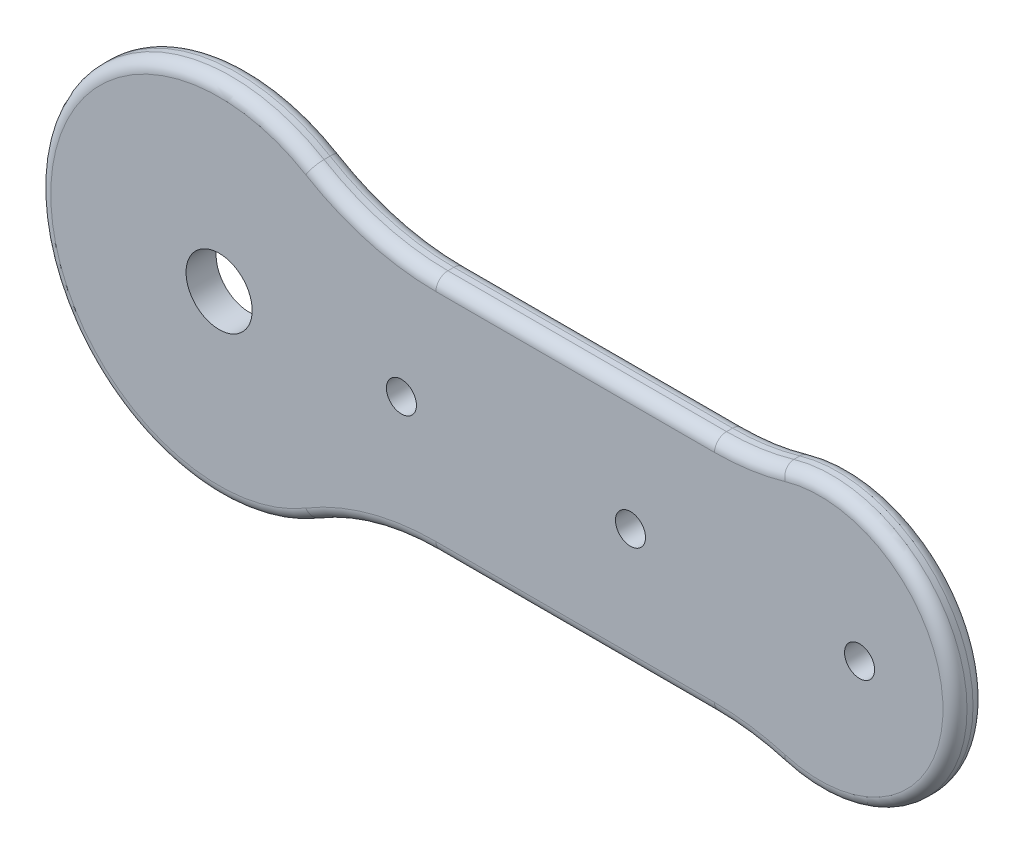
ISO-10303-21;
HEADER;
FILE_DESCRIPTION(('STEP AP214'),'2;1');
FILE_NAME('part.step','',(''),(''),'','','');
FILE_SCHEMA(('AUTOMOTIVE_DESIGN { 1 0 10303 214 1 1 1 1 }'));
ENDSEC;
DATA;
#1=APPLICATION_CONTEXT('core data for automotive mechanical design processes');
#2=APPLICATION_PROTOCOL_DEFINITION('international standard','automotive_design',2000,#1);
#3=PRODUCT_CONTEXT('',#1,'mechanical');
#4=PRODUCT('Part','Part','',(#3));
#5=PRODUCT_RELATED_PRODUCT_CATEGORY('part','',(#4));
#6=PRODUCT_DEFINITION_FORMATION('','',#4);
#7=PRODUCT_DEFINITION_CONTEXT('part definition',#1,'design');
#8=PRODUCT_DEFINITION('design','',#6,#7);
#9=PRODUCT_DEFINITION_SHAPE('','',#8);
#10=(LENGTH_UNIT() NAMED_UNIT(*) SI_UNIT(.MILLI.,.METRE.));
#11=(NAMED_UNIT(*) PLANE_ANGLE_UNIT() SI_UNIT($,.RADIAN.));
#12=(NAMED_UNIT(*) SI_UNIT($,.STERADIAN.) SOLID_ANGLE_UNIT());
#13=UNCERTAINTY_MEASURE_WITH_UNIT(LENGTH_MEASURE(1.E-05),#10,'distance_accuracy_value','');
#14=(GEOMETRIC_REPRESENTATION_CONTEXT(3) GLOBAL_UNCERTAINTY_ASSIGNED_CONTEXT((#13)) GLOBAL_UNIT_ASSIGNED_CONTEXT((#10,
#11,#12)) REPRESENTATION_CONTEXT('',''));
#15=CARTESIAN_POINT('',(0.,0.,0.));
#16=DIRECTION('',(0.,0.,1.));
#17=DIRECTION('',(1.,0.,0.));
#18=AXIS2_PLACEMENT_3D('',#15,#16,#17);
#19=CARTESIAN_POINT('',(0.,40.,10.));
#20=DIRECTION('',(0.,1.,0.));
#21=DIRECTION('',(0.,0.,1.));
#22=AXIS2_PLACEMENT_3D('',#19,#20,#21);
#23=PLANE('',#22);
#24=DIRECTION('',(0.,0.,-1.));
#25=VECTOR('',#24,1.);
#26=CARTESIAN_POINT('',(64.9,40.,10.));
#27=LINE('',#26,#25);
#28=CARTESIAN_POINT('',(64.9,40.,6.));
#29=VERTEX_POINT('',#28);
#30=CARTESIAN_POINT('',(64.9,40.,4.));
#31=VERTEX_POINT('',#30);
#32=EDGE_CURVE('E304',#29,#31,#27,.T.);
#33=ORIENTED_EDGE('',*,*,#32,.T.);
#34=DIRECTION('',(1.,0.,0.));
#35=VECTOR('',#34,1.);
#36=CARTESIAN_POINT('',(-27.7889744907202,40.,4.));
#37=LINE('',#36,#35);
#38=CARTESIAN_POINT('',(-27.7889744907202,40.,4.));
#39=VERTEX_POINT('',#38);
#40=EDGE_CURVE('E167',#31,#39,#37,.F.);
#41=ORIENTED_EDGE('',*,*,#40,.T.);
#42=DIRECTION('',(0.,0.,-1.));
#43=VECTOR('',#42,1.);
#44=CARTESIAN_POINT('',(-27.7889744907202,40.,10.));
#45=LINE('',#44,#43);
#46=CARTESIAN_POINT('',(-27.7889744907202,40.,6.));
#47=VERTEX_POINT('',#46);
#48=EDGE_CURVE('E313',#39,#47,#45,.F.);
#49=ORIENTED_EDGE('',*,*,#48,.T.);
#50=DIRECTION('',(1.,0.,0.));
#51=VECTOR('',#50,1.);
#52=CARTESIAN_POINT('',(0.,40.,6.));
#53=LINE('',#52,#51);
#54=EDGE_CURVE('E199',#47,#29,#53,.T.);
#55=ORIENTED_EDGE('',*,*,#54,.T.);
#56=EDGE_LOOP('',(#33,#41,#49,#55));
#57=FACE_BOUND('',#56,.T.);
#58=ADVANCED_FACE('F47',(#57),#23,.T.);
#59=CARTESIAN_POINT('',(-99.9,0.,10.));
#60=DIRECTION('',(0.,0.,-1.));
#61=DIRECTION('',(-1.,0.,0.));
#62=AXIS2_PLACEMENT_3D('',#59,#60,#61);
#63=CYLINDRICAL_SURFACE('',#62,60.);
#64=DIRECTION('',(0.,0.,-1.));
#65=VECTOR('',#64,1.);
#66=CARTESIAN_POINT('',(-68.9952747817372,51.4285714285714,10.));
#67=LINE('',#66,#65);
#68=CARTESIAN_POINT('',(-68.9952747817372,51.4285714285714,6.));
#69=VERTEX_POINT('',#68);
#70=CARTESIAN_POINT('',(-68.9952747817372,51.4285714285714,4.));
#71=VERTEX_POINT('',#70);
#72=EDGE_CURVE('E293',#69,#71,#67,.T.);
#73=ORIENTED_EDGE('',*,*,#72,.T.);
#74=CARTESIAN_POINT('',(-99.9,0.,4.));
#75=DIRECTION('',(0.,0.,1.));
#76=DIRECTION('',(1.,0.,0.));
#77=AXIS2_PLACEMENT_3D('',#74,#75,#76);
#78=CIRCLE('',#77,60.);
#79=CARTESIAN_POINT('',(-68.9952747817372,-51.4285714285714,4.));
#80=VERTEX_POINT('',#79);
#81=EDGE_CURVE('E204',#71,#80,#78,.T.);
#82=ORIENTED_EDGE('',*,*,#81,.T.);
#83=DIRECTION('',(0.,0.,-1.));
#84=VECTOR('',#83,1.);
#85=CARTESIAN_POINT('',(-68.9952747817372,-51.4285714285714,10.));
#86=LINE('',#85,#84);
#87=CARTESIAN_POINT('',(-68.9952747817372,-51.4285714285714,6.));
#88=VERTEX_POINT('',#87);
#89=EDGE_CURVE('E296',#80,#88,#86,.F.);
#90=ORIENTED_EDGE('',*,*,#89,.T.);
#91=CARTESIAN_POINT('',(-99.9,0.,6.));
#92=DIRECTION('',(0.,0.,1.));
#93=DIRECTION('',(1.,0.,0.));
#94=AXIS2_PLACEMENT_3D('',#91,#92,#93);
#95=CIRCLE('',#94,60.);
#96=EDGE_CURVE('E202',#88,#69,#95,.F.);
#97=ORIENTED_EDGE('',*,*,#96,.T.);
#98=EDGE_LOOP('',(#73,#82,#90,#97));
#99=FACE_BOUND('',#98,.T.);
#100=ADVANCED_FACE('F292',(#99),#63,.T.);
#101=CARTESIAN_POINT('',(0.,-40.,10.));
#102=DIRECTION('',(0.,1.,0.));
#103=DIRECTION('',(0.,0.,1.));
#104=AXIS2_PLACEMENT_3D('',#101,#102,#103);
#105=PLANE('',#104);
#106=DIRECTION('',(0.,0.,1.));
#107=VECTOR('',#106,1.);
#108=CARTESIAN_POINT('',(-27.7889744907202,-40.,0.));
#109=LINE('',#108,#107);
#110=CARTESIAN_POINT('',(-27.7889744907202,-40.,6.));
#111=VERTEX_POINT('',#110);
#112=CARTESIAN_POINT('',(-27.7889744907202,-40.,4.));
#113=VERTEX_POINT('',#112);
#114=EDGE_CURVE('E302',#111,#113,#109,.F.);
#115=ORIENTED_EDGE('',*,*,#114,.T.);
#116=DIRECTION('',(1.,0.,0.));
#117=VECTOR('',#116,1.);
#118=CARTESIAN_POINT('',(0.,-40.,4.));
#119=LINE('',#118,#117);
#120=CARTESIAN_POINT('',(64.9,-40.,4.));
#121=VERTEX_POINT('',#120);
#122=EDGE_CURVE('E208',#113,#121,#119,.T.);
#123=ORIENTED_EDGE('',*,*,#122,.T.);
#124=DIRECTION('',(0.,0.,1.));
#125=VECTOR('',#124,1.);
#126=CARTESIAN_POINT('',(64.9,-40.,10.));
#127=LINE('',#126,#125);
#128=CARTESIAN_POINT('',(64.9,-40.,6.));
#129=VERTEX_POINT('',#128);
#130=EDGE_CURVE('E307',#121,#129,#127,.T.);
#131=ORIENTED_EDGE('',*,*,#130,.T.);
#132=DIRECTION('',(1.,0.,0.));
#133=VECTOR('',#132,1.);
#134=CARTESIAN_POINT('',(-27.7889744907202,-40.,6.));
#135=LINE('',#134,#133);
#136=EDGE_CURVE('E206',#129,#111,#135,.F.);
#137=ORIENTED_EDGE('',*,*,#136,.T.);
#138=EDGE_LOOP('',(#115,#123,#131,#137));
#139=FACE_BOUND('',#138,.T.);
#140=ADVANCED_FACE('F363',(#139),#105,.F.);
#141=CARTESIAN_POINT('',(36.95,0.,10.));
#142=DIRECTION('',(0.,0.,-1.));
#143=DIRECTION('',(-1.,0.,0.));
#144=AXIS2_PLACEMENT_3D('',#141,#142,#143);
#145=CYLINDRICAL_SURFACE('',#144,5.);
#146=CARTESIAN_POINT('',(36.95,0.,10.));
#147=DIRECTION('',(0.,0.,1.));
#148=DIRECTION('',(1.,0.,0.));
#149=AXIS2_PLACEMENT_3D('',#146,#147,#148);
#150=CIRCLE('',#149,5.);
#151=CARTESIAN_POINT('',(41.95,0.,10.));
#152=VERTEX_POINT('',#151);
#153=EDGE_CURVE('E658',#152,#152,#150,.T.);
#154=ORIENTED_EDGE('',*,*,#153,.T.);
#155=EDGE_LOOP('',(#154));
#156=FACE_BOUND('',#155,.T.);
#157=CARTESIAN_POINT('',(36.95,0.,0.));
#158=DIRECTION('',(0.,0.,1.));
#159=DIRECTION('',(1.,0.,0.));
#160=AXIS2_PLACEMENT_3D('',#157,#158,#159);
#161=CIRCLE('',#160,5.);
#162=CARTESIAN_POINT('',(41.95,0.,0.));
#163=VERTEX_POINT('',#162);
#164=EDGE_CURVE('E661',#163,#163,#161,.T.);
#165=ORIENTED_EDGE('',*,*,#164,.F.);
#166=EDGE_LOOP('',(#165));
#167=FACE_BOUND('',#166,.T.);
#168=ADVANCED_FACE('F591',(#156,#167),#145,.F.);
#169=CARTESIAN_POINT('',(-39.25,-1.83164518450014E-13,10.));
#170=DIRECTION('',(0.,0.,-1.));
#171=DIRECTION('',(-1.,0.,0.));
#172=AXIS2_PLACEMENT_3D('',#169,#170,#171);
#173=CYLINDRICAL_SURFACE('',#172,5.);
#174=CARTESIAN_POINT('',(-39.25,-1.83164518450014E-13,10.));
#175=DIRECTION('',(0.,0.,1.));
#176=DIRECTION('',(1.,0.,0.));
#177=AXIS2_PLACEMENT_3D('',#174,#175,#176);
#178=CIRCLE('',#177,5.);
#179=CARTESIAN_POINT('',(-34.25,-1.83164518450014E-13,10.));
#180=VERTEX_POINT('',#179);
#181=EDGE_CURVE('E677',#180,#180,#178,.T.);
#182=ORIENTED_EDGE('',*,*,#181,.T.);
#183=EDGE_LOOP('',(#182));
#184=FACE_BOUND('',#183,.T.);
#185=CARTESIAN_POINT('',(-39.25,-1.83164518450014E-13,0.));
#186=DIRECTION('',(0.,0.,1.));
#187=DIRECTION('',(1.,0.,0.));
#188=AXIS2_PLACEMENT_3D('',#185,#186,#187);
#189=CIRCLE('',#188,5.);
#190=CARTESIAN_POINT('',(-34.25,-1.83164518450014E-13,0.));
#191=VERTEX_POINT('',#190);
#192=EDGE_CURVE('E664',#191,#191,#189,.T.);
#193=ORIENTED_EDGE('',*,*,#192,.F.);
#194=EDGE_LOOP('',(#193));
#195=FACE_BOUND('',#194,.T.);
#196=ADVANCED_FACE('F582',(#184,#195),#173,.F.);
#197=CARTESIAN_POINT('',(-99.9,0.,10.));
#198=DIRECTION('',(0.,0.,-1.));
#199=DIRECTION('',(-1.,0.,0.));
#200=AXIS2_PLACEMENT_3D('',#197,#198,#199);
#201=CYLINDRICAL_SURFACE('',#200,11.);
#202=CARTESIAN_POINT('',(-99.9,0.,10.));
#203=DIRECTION('',(0.,0.,1.));
#204=DIRECTION('',(1.,0.,0.));
#205=AXIS2_PLACEMENT_3D('',#202,#203,#204);
#206=CIRCLE('',#205,11.);
#207=CARTESIAN_POINT('',(-88.9,0.,10.));
#208=VERTEX_POINT('',#207);
#209=EDGE_CURVE('E667',#208,#208,#206,.T.);
#210=ORIENTED_EDGE('',*,*,#209,.T.);
#211=EDGE_LOOP('',(#210));
#212=FACE_BOUND('',#211,.T.);
#213=CARTESIAN_POINT('',(-99.9,0.,0.));
#214=DIRECTION('',(0.,0.,1.));
#215=DIRECTION('',(1.,0.,0.));
#216=AXIS2_PLACEMENT_3D('',#213,#214,#215);
#217=CIRCLE('',#216,11.);
#218=CARTESIAN_POINT('',(-88.9,0.,0.));
#219=VERTEX_POINT('',#218);
#220=EDGE_CURVE('E260',#219,#219,#217,.T.);
#221=ORIENTED_EDGE('',*,*,#220,.F.);
#222=EDGE_LOOP('',(#221));
#223=FACE_BOUND('',#222,.T.);
#224=ADVANCED_FACE('F574',(#212,#223),#201,.F.);
#225=CARTESIAN_POINT('',(99.9,0.,10.));
#226=DIRECTION('',(0.,0.,-1.));
#227=DIRECTION('',(-1.,0.,0.));
#228=AXIS2_PLACEMENT_3D('',#225,#226,#227);
#229=CYLINDRICAL_SURFACE('',#228,45.);
#230=DIRECTION('',(0.,0.,-1.));
#231=VECTOR('',#230,1.);
#232=CARTESIAN_POINT('',(87.3,-43.2,10.));
#233=LINE('',#232,#231);
#234=CARTESIAN_POINT('',(87.3,-43.2,6.));
#235=VERTEX_POINT('',#234);
#236=CARTESIAN_POINT('',(87.3,-43.2,4.));
#237=VERTEX_POINT('',#236);
#238=EDGE_CURVE('E180',#235,#237,#233,.T.);
#239=ORIENTED_EDGE('',*,*,#238,.T.);
#240=CARTESIAN_POINT('',(99.9,0.,4.));
#241=DIRECTION('',(0.,0.,1.));
#242=DIRECTION('',(1.,0.,0.));
#243=AXIS2_PLACEMENT_3D('',#240,#241,#242);
#244=CIRCLE('',#243,45.);
#245=CARTESIAN_POINT('',(87.3,43.2,4.));
#246=VERTEX_POINT('',#245);
#247=EDGE_CURVE('E213',#237,#246,#244,.T.);
#248=ORIENTED_EDGE('',*,*,#247,.T.);
#249=DIRECTION('',(0.,0.,-1.));
#250=VECTOR('',#249,1.);
#251=CARTESIAN_POINT('',(87.3,43.2,10.));
#252=LINE('',#251,#250);
#253=CARTESIAN_POINT('',(87.3,43.2,6.));
#254=VERTEX_POINT('',#253);
#255=EDGE_CURVE('E315',#246,#254,#252,.F.);
#256=ORIENTED_EDGE('',*,*,#255,.T.);
#257=CARTESIAN_POINT('',(99.9,0.,6.));
#258=DIRECTION('',(0.,0.,1.));
#259=DIRECTION('',(1.,0.,0.));
#260=AXIS2_PLACEMENT_3D('',#257,#258,#259);
#261=CIRCLE('',#260,45.);
#262=EDGE_CURVE('E210',#254,#235,#261,.F.);
#263=ORIENTED_EDGE('',*,*,#262,.T.);
#264=EDGE_LOOP('',(#239,#248,#256,#263));
#265=FACE_BOUND('',#264,.T.);
#266=ADVANCED_FACE('F322',(#265),#229,.T.);
#267=CARTESIAN_POINT('',(113.15,0.,10.));
#268=DIRECTION('',(0.,0.,-1.));
#269=DIRECTION('',(-1.,0.,0.));
#270=AXIS2_PLACEMENT_3D('',#267,#268,#269);
#271=CYLINDRICAL_SURFACE('',#270,5.);
#272=CARTESIAN_POINT('',(113.15,0.,10.));
#273=DIRECTION('',(0.,0.,1.));
#274=DIRECTION('',(1.,0.,0.));
#275=AXIS2_PLACEMENT_3D('',#272,#273,#274);
#276=CIRCLE('',#275,5.);
#277=CARTESIAN_POINT('',(118.15,0.,10.));
#278=VERTEX_POINT('',#277);
#279=EDGE_CURVE('E366',#278,#278,#276,.T.);
#280=ORIENTED_EDGE('',*,*,#279,.T.);
#281=EDGE_LOOP('',(#280));
#282=FACE_BOUND('',#281,.T.);
#283=CARTESIAN_POINT('',(113.15,0.,0.));
#284=DIRECTION('',(0.,0.,1.));
#285=DIRECTION('',(1.,0.,0.));
#286=AXIS2_PLACEMENT_3D('',#283,#284,#285);
#287=CIRCLE('',#286,5.);
#288=CARTESIAN_POINT('',(118.15,0.,0.));
#289=VERTEX_POINT('',#288);
#290=EDGE_CURVE('E663',#289,#289,#287,.T.);
#291=ORIENTED_EDGE('',*,*,#290,.F.);
#292=EDGE_LOOP('',(#291));
#293=FACE_BOUND('',#292,.T.);
#294=ADVANCED_FACE('F558',(#282,#293),#271,.F.);
#295=CARTESIAN_POINT('',(0.,0.,10.));
#296=DIRECTION('',(0.,0.,1.));
#297=DIRECTION('',(1.,0.,0.));
#298=AXIS2_PLACEMENT_3D('',#295,#296,#297);
#299=PLANE('',#298);
#300=CARTESIAN_POINT('',(-99.9,0.,10.));
#301=DIRECTION('',(0.,0.,1.));
#302=DIRECTION('',(1.,0.,0.));
#303=AXIS2_PLACEMENT_3D('',#300,#301,#302);
#304=CIRCLE('',#303,56.);
#305=CARTESIAN_POINT('',(-71.0555897962881,48.,10.));
#306=VERTEX_POINT('',#305);
#307=CARTESIAN_POINT('',(-71.0555897962881,-48.,10.));
#308=VERTEX_POINT('',#307);
#309=EDGE_CURVE('E69',#306,#308,#304,.T.);
#310=ORIENTED_EDGE('',*,*,#309,.T.);
#311=CARTESIAN_POINT('',(-27.7889744907202,-120.,10.));
#312=DIRECTION('',(0.,0.,1.));
#313=DIRECTION('',(1.,0.,0.));
#314=AXIS2_PLACEMENT_3D('',#311,#312,#313);
#315=CIRCLE('',#314,84.);
#316=CARTESIAN_POINT('',(-27.7889744907202,-36.,10.));
#317=VERTEX_POINT('',#316);
#318=EDGE_CURVE('E64',#308,#317,#315,.F.);
#319=ORIENTED_EDGE('',*,*,#318,.T.);
#320=DIRECTION('',(1.,0.,0.));
#321=VECTOR('',#320,1.);
#322=CARTESIAN_POINT('',(64.9,-36.,10.));
#323=LINE('',#322,#321);
#324=CARTESIAN_POINT('',(64.9,-36.,10.));
#325=VERTEX_POINT('',#324);
#326=EDGE_CURVE('E227',#317,#325,#323,.T.);
#327=ORIENTED_EDGE('',*,*,#326,.T.);
#328=CARTESIAN_POINT('',(64.9,-120.,10.));
#329=DIRECTION('',(0.,0.,1.));
#330=DIRECTION('',(1.,0.,0.));
#331=AXIS2_PLACEMENT_3D('',#328,#329,#330);
#332=CIRCLE('',#331,84.);
#333=CARTESIAN_POINT('',(88.42,-39.36,10.));
#334=VERTEX_POINT('',#333);
#335=EDGE_CURVE('E222',#325,#334,#332,.F.);
#336=ORIENTED_EDGE('',*,*,#335,.T.);
#337=CARTESIAN_POINT('',(99.9,0.,10.));
#338=DIRECTION('',(0.,0.,1.));
#339=DIRECTION('',(1.,0.,0.));
#340=AXIS2_PLACEMENT_3D('',#337,#338,#339);
#341=CIRCLE('',#340,41.);
#342=CARTESIAN_POINT('',(88.42,39.36,10.));
#343=VERTEX_POINT('',#342);
#344=EDGE_CURVE('E219',#334,#343,#341,.T.);
#345=ORIENTED_EDGE('',*,*,#344,.T.);
#346=CARTESIAN_POINT('',(64.9,120.,10.));
#347=DIRECTION('',(0.,0.,1.));
#348=DIRECTION('',(1.,0.,0.));
#349=AXIS2_PLACEMENT_3D('',#346,#347,#348);
#350=CIRCLE('',#349,84.);
#351=CARTESIAN_POINT('',(64.9,36.,10.));
#352=VERTEX_POINT('',#351);
#353=EDGE_CURVE('E215',#343,#352,#350,.F.);
#354=ORIENTED_EDGE('',*,*,#353,.T.);
#355=DIRECTION('',(1.,0.,0.));
#356=VECTOR('',#355,1.);
#357=CARTESIAN_POINT('',(0.,36.,10.));
#358=LINE('',#357,#356);
#359=CARTESIAN_POINT('',(-27.7889744907202,36.,10.));
#360=VERTEX_POINT('',#359);
#361=EDGE_CURVE('E217',#352,#360,#358,.F.);
#362=ORIENTED_EDGE('',*,*,#361,.T.);
#363=CARTESIAN_POINT('',(-27.7889744907202,120.,10.));
#364=DIRECTION('',(0.,0.,1.));
#365=DIRECTION('',(1.,0.,0.));
#366=AXIS2_PLACEMENT_3D('',#363,#364,#365);
#367=CIRCLE('',#366,84.);
#368=EDGE_CURVE('E224',#360,#306,#367,.F.);
#369=ORIENTED_EDGE('',*,*,#368,.T.);
#370=EDGE_LOOP('',(#310,#319,#327,#336,#345,#354,#362,#369));
#371=FACE_BOUND('',#370,.T.);
#372=ORIENTED_EDGE('',*,*,#209,.F.);
#373=EDGE_LOOP('',(#372));
#374=FACE_BOUND('',#373,.T.);
#375=ORIENTED_EDGE('',*,*,#181,.F.);
#376=EDGE_LOOP('',(#375));
#377=FACE_BOUND('',#376,.T.);
#378=ORIENTED_EDGE('',*,*,#153,.F.);
#379=EDGE_LOOP('',(#378));
#380=FACE_BOUND('',#379,.T.);
#381=ORIENTED_EDGE('',*,*,#279,.F.);
#382=EDGE_LOOP('',(#381));
#383=FACE_BOUND('',#382,.T.);
#384=ADVANCED_FACE('F370',(#371,#374,#377,#380,#383),#299,.T.);
#385=CARTESIAN_POINT('',(0.,0.,0.));
#386=DIRECTION('',(0.,0.,1.));
#387=DIRECTION('',(1.,0.,0.));
#388=AXIS2_PLACEMENT_3D('',#385,#386,#387);
#389=PLANE('',#388);
#390=DIRECTION('',(1.,0.,0.));
#391=VECTOR('',#390,1.);
#392=CARTESIAN_POINT('',(0.,-36.,0.));
#393=LINE('',#392,#391);
#394=CARTESIAN_POINT('',(64.9,-36.,0.));
#395=VERTEX_POINT('',#394);
#396=CARTESIAN_POINT('',(-27.7889744907202,-36.,0.));
#397=VERTEX_POINT('',#396);
#398=EDGE_CURVE('E193',#395,#397,#393,.F.);
#399=ORIENTED_EDGE('',*,*,#398,.T.);
#400=CARTESIAN_POINT('',(-27.7889744907202,-120.,0.));
#401=DIRECTION('',(0.,0.,1.));
#402=DIRECTION('',(1.,0.,0.));
#403=AXIS2_PLACEMENT_3D('',#400,#401,#402);
#404=CIRCLE('',#403,84.);
#405=CARTESIAN_POINT('',(-71.0555897962881,-48.,0.));
#406=VERTEX_POINT('',#405);
#407=EDGE_CURVE('E197',#397,#406,#404,.T.);
#408=ORIENTED_EDGE('',*,*,#407,.T.);
#409=CARTESIAN_POINT('',(-99.9,0.,0.));
#410=DIRECTION('',(0.,0.,1.));
#411=DIRECTION('',(1.,0.,0.));
#412=AXIS2_PLACEMENT_3D('',#409,#410,#411);
#413=CIRCLE('',#412,56.);
#414=CARTESIAN_POINT('',(-71.0555897962881,48.,0.));
#415=VERTEX_POINT('',#414);
#416=EDGE_CURVE('E195',#406,#415,#413,.F.);
#417=ORIENTED_EDGE('',*,*,#416,.T.);
#418=CARTESIAN_POINT('',(-27.7889744907202,120.,0.));
#419=DIRECTION('',(0.,0.,1.));
#420=DIRECTION('',(1.,0.,0.));
#421=AXIS2_PLACEMENT_3D('',#418,#419,#420);
#422=CIRCLE('',#421,84.);
#423=CARTESIAN_POINT('',(-27.7889744907202,36.,0.));
#424=VERTEX_POINT('',#423);
#425=EDGE_CURVE('E185',#415,#424,#422,.T.);
#426=ORIENTED_EDGE('',*,*,#425,.T.);
#427=DIRECTION('',(1.,0.,0.));
#428=VECTOR('',#427,1.);
#429=CARTESIAN_POINT('',(64.9,36.,0.));
#430=LINE('',#429,#428);
#431=CARTESIAN_POINT('',(64.9,36.,0.));
#432=VERTEX_POINT('',#431);
#433=EDGE_CURVE('E165',#424,#432,#430,.T.);
#434=ORIENTED_EDGE('',*,*,#433,.T.);
#435=CARTESIAN_POINT('',(64.9,120.,0.));
#436=DIRECTION('',(0.,0.,1.));
#437=DIRECTION('',(1.,0.,0.));
#438=AXIS2_PLACEMENT_3D('',#435,#436,#437);
#439=CIRCLE('',#438,84.);
#440=CARTESIAN_POINT('',(88.42,39.36,0.));
#441=VERTEX_POINT('',#440);
#442=EDGE_CURVE('E173',#432,#441,#439,.T.);
#443=ORIENTED_EDGE('',*,*,#442,.T.);
#444=CARTESIAN_POINT('',(99.9,0.,0.));
#445=DIRECTION('',(0.,0.,1.));
#446=DIRECTION('',(1.,0.,0.));
#447=AXIS2_PLACEMENT_3D('',#444,#445,#446);
#448=CIRCLE('',#447,41.);
#449=CARTESIAN_POINT('',(88.42,-39.36,0.));
#450=VERTEX_POINT('',#449);
#451=EDGE_CURVE('E179',#441,#450,#448,.F.);
#452=ORIENTED_EDGE('',*,*,#451,.T.);
#453=CARTESIAN_POINT('',(64.9,-120.,0.));
#454=DIRECTION('',(0.,0.,1.));
#455=DIRECTION('',(1.,0.,0.));
#456=AXIS2_PLACEMENT_3D('',#453,#454,#455);
#457=CIRCLE('',#456,84.);
#458=EDGE_CURVE('E187',#450,#395,#457,.T.);
#459=ORIENTED_EDGE('',*,*,#458,.T.);
#460=EDGE_LOOP('',(#399,#408,#417,#426,#434,#443,#452,#459));
#461=FACE_BOUND('',#460,.T.);
#462=ORIENTED_EDGE('',*,*,#220,.T.);
#463=EDGE_LOOP('',(#462));
#464=FACE_BOUND('',#463,.T.);
#465=ORIENTED_EDGE('',*,*,#192,.T.);
#466=EDGE_LOOP('',(#465));
#467=FACE_BOUND('',#466,.T.);
#468=ORIENTED_EDGE('',*,*,#164,.T.);
#469=EDGE_LOOP('',(#468));
#470=FACE_BOUND('',#469,.T.);
#471=ORIENTED_EDGE('',*,*,#290,.T.);
#472=EDGE_LOOP('',(#471));
#473=FACE_BOUND('',#472,.T.);
#474=ADVANCED_FACE('F182',(#461,#464,#467,#470,#473),#389,.F.);
#475=CARTESIAN_POINT('',(-27.7889744907202,-120.,10.));
#476=DIRECTION('',(0.,0.,-1.));
#477=DIRECTION('',(-1.,0.,0.));
#478=AXIS2_PLACEMENT_3D('',#475,#476,#477);
#479=CYLINDRICAL_SURFACE('',#478,80.);
#480=ORIENTED_EDGE('',*,*,#89,.F.);
#481=CARTESIAN_POINT('',(-27.7889744907202,-120.,4.));
#482=DIRECTION('',(0.,0.,1.));
#483=DIRECTION('',(1.,0.,0.));
#484=AXIS2_PLACEMENT_3D('',#481,#482,#483);
#485=CIRCLE('',#484,80.);
#486=EDGE_CURVE('E232',#80,#113,#485,.F.);
#487=ORIENTED_EDGE('',*,*,#486,.T.);
#488=ORIENTED_EDGE('',*,*,#114,.F.);
#489=CARTESIAN_POINT('',(-27.7889744907202,-120.,6.));
#490=DIRECTION('',(0.,0.,1.));
#491=DIRECTION('',(1.,0.,0.));
#492=AXIS2_PLACEMENT_3D('',#489,#490,#491);
#493=CIRCLE('',#492,80.);
#494=EDGE_CURVE('E230',#111,#88,#493,.T.);
#495=ORIENTED_EDGE('',*,*,#494,.T.);
#496=EDGE_LOOP('',(#480,#487,#488,#495));
#497=FACE_BOUND('',#496,.T.);
#498=ADVANCED_FACE('F389',(#497),#479,.F.);
#499=CARTESIAN_POINT('',(-27.7889744907202,120.,10.));
#500=DIRECTION('',(0.,0.,-1.));
#501=DIRECTION('',(-1.,0.,0.));
#502=AXIS2_PLACEMENT_3D('',#499,#500,#501);
#503=CYLINDRICAL_SURFACE('',#502,80.);
#504=ORIENTED_EDGE('',*,*,#48,.F.);
#505=CARTESIAN_POINT('',(-27.7889744907202,120.,4.));
#506=DIRECTION('',(0.,0.,1.));
#507=DIRECTION('',(1.,0.,0.));
#508=AXIS2_PLACEMENT_3D('',#505,#506,#507);
#509=CIRCLE('',#508,80.);
#510=EDGE_CURVE('E236',#39,#71,#509,.F.);
#511=ORIENTED_EDGE('',*,*,#510,.T.);
#512=ORIENTED_EDGE('',*,*,#72,.F.);
#513=CARTESIAN_POINT('',(-27.7889744907202,120.,6.));
#514=DIRECTION('',(0.,0.,1.));
#515=DIRECTION('',(1.,0.,0.));
#516=AXIS2_PLACEMENT_3D('',#513,#514,#515);
#517=CIRCLE('',#516,80.);
#518=EDGE_CURVE('E234',#69,#47,#517,.T.);
#519=ORIENTED_EDGE('',*,*,#518,.T.);
#520=EDGE_LOOP('',(#504,#511,#512,#519));
#521=FACE_BOUND('',#520,.T.);
#522=ADVANCED_FACE('F299',(#521),#503,.F.);
#523=CARTESIAN_POINT('',(64.9,-120.,10.));
#524=DIRECTION('',(0.,0.,-1.));
#525=DIRECTION('',(-1.,0.,0.));
#526=AXIS2_PLACEMENT_3D('',#523,#524,#525);
#527=CYLINDRICAL_SURFACE('',#526,80.);
#528=ORIENTED_EDGE('',*,*,#130,.F.);
#529=CARTESIAN_POINT('',(64.9,-120.,4.));
#530=DIRECTION('',(0.,0.,1.));
#531=DIRECTION('',(1.,0.,0.));
#532=AXIS2_PLACEMENT_3D('',#529,#530,#531);
#533=CIRCLE('',#532,80.);
#534=EDGE_CURVE('E240',#121,#237,#533,.F.);
#535=ORIENTED_EDGE('',*,*,#534,.T.);
#536=ORIENTED_EDGE('',*,*,#238,.F.);
#537=CARTESIAN_POINT('',(64.9,-120.,6.));
#538=DIRECTION('',(0.,0.,1.));
#539=DIRECTION('',(1.,0.,0.));
#540=AXIS2_PLACEMENT_3D('',#537,#538,#539);
#541=CIRCLE('',#540,80.);
#542=EDGE_CURVE('E238',#235,#129,#541,.T.);
#543=ORIENTED_EDGE('',*,*,#542,.T.);
#544=EDGE_LOOP('',(#528,#535,#536,#543));
#545=FACE_BOUND('',#544,.T.);
#546=ADVANCED_FACE('F359',(#545),#527,.F.);
#547=CARTESIAN_POINT('',(64.9,120.,10.));
#548=DIRECTION('',(0.,0.,-1.));
#549=DIRECTION('',(-1.,0.,0.));
#550=AXIS2_PLACEMENT_3D('',#547,#548,#549);
#551=CYLINDRICAL_SURFACE('',#550,80.);
#552=ORIENTED_EDGE('',*,*,#255,.F.);
#553=CARTESIAN_POINT('',(64.9,120.,4.));
#554=DIRECTION('',(0.,0.,1.));
#555=DIRECTION('',(1.,0.,0.));
#556=AXIS2_PLACEMENT_3D('',#553,#554,#555);
#557=CIRCLE('',#556,80.);
#558=EDGE_CURVE('E11',#246,#31,#557,.F.);
#559=ORIENTED_EDGE('',*,*,#558,.T.);
#560=ORIENTED_EDGE('',*,*,#32,.F.);
#561=CARTESIAN_POINT('',(64.9,120.,6.));
#562=DIRECTION('',(0.,0.,1.));
#563=DIRECTION('',(1.,0.,0.));
#564=AXIS2_PLACEMENT_3D('',#561,#562,#563);
#565=CIRCLE('',#564,80.);
#566=EDGE_CURVE('E56',#29,#254,#565,.T.);
#567=ORIENTED_EDGE('',*,*,#566,.T.);
#568=EDGE_LOOP('',(#552,#559,#560,#567));
#569=FACE_BOUND('',#568,.T.);
#570=ADVANCED_FACE('F335',(#569),#551,.F.);
#571=CARTESIAN_POINT('',(0.,-36.,4.));
#572=DIRECTION('',(1.,0.,0.));
#573=DIRECTION('',(0.,0.,-1.));
#574=AXIS2_PLACEMENT_3D('',#571,#572,#573);
#575=CYLINDRICAL_SURFACE('',#574,4.);
#576=CARTESIAN_POINT('',(64.9,-36.,4.));
#577=DIRECTION('',(1.,0.,0.));
#578=DIRECTION('',(0.,0.,-1.));
#579=AXIS2_PLACEMENT_3D('',#576,#577,#578);
#580=CIRCLE('',#579,4.);
#581=EDGE_CURVE('E254',#121,#395,#580,.T.);
#582=ORIENTED_EDGE('',*,*,#581,.F.);
#583=ORIENTED_EDGE('',*,*,#122,.F.);
#584=CARTESIAN_POINT('',(-27.7889744907202,-36.,4.));
#585=DIRECTION('',(-1.,0.,0.));
#586=DIRECTION('',(0.,0.,1.));
#587=AXIS2_PLACEMENT_3D('',#584,#585,#586);
#588=CIRCLE('',#587,4.);
#589=EDGE_CURVE('E257',#397,#113,#588,.T.);
#590=ORIENTED_EDGE('',*,*,#589,.F.);
#591=ORIENTED_EDGE('',*,*,#398,.F.);
#592=EDGE_LOOP('',(#582,#583,#590,#591));
#593=FACE_BOUND('',#592,.T.);
#594=ADVANCED_FACE('F399',(#593),#575,.T.);
#595=CARTESIAN_POINT('',(-27.7889744907202,-120.,4.));
#596=DIRECTION('',(0.,0.,1.));
#597=DIRECTION('',(1.,0.,0.));
#598=AXIS2_PLACEMENT_3D('',#595,#596,#597);
#599=TOROIDAL_SURFACE('',#598,84.,4.);
#600=ORIENTED_EDGE('',*,*,#589,.T.);
#601=ORIENTED_EDGE('',*,*,#486,.F.);
#602=CARTESIAN_POINT('',(-71.0555897962881,-48.,4.));
#603=DIRECTION('',(-0.857142857142857,-0.515078753637713,0.));
#604=DIRECTION('',(0.515078753637713,-0.857142857142857,0.));
#605=AXIS2_PLACEMENT_3D('',#602,#603,#604);
#606=CIRCLE('',#605,4.);
#607=EDGE_CURVE('E251',#406,#80,#606,.T.);
#608=ORIENTED_EDGE('',*,*,#607,.F.);
#609=ORIENTED_EDGE('',*,*,#407,.F.);
#610=EDGE_LOOP('',(#600,#601,#608,#609));
#611=FACE_BOUND('',#610,.T.);
#612=ADVANCED_FACE('F416',(#611),#599,.T.);
#613=CARTESIAN_POINT('',(64.9,-120.,4.));
#614=DIRECTION('',(0.,0.,1.));
#615=DIRECTION('',(1.,0.,0.));
#616=AXIS2_PLACEMENT_3D('',#613,#614,#615);
#617=TOROIDAL_SURFACE('',#616,84.,4.);
#618=ORIENTED_EDGE('',*,*,#581,.T.);
#619=ORIENTED_EDGE('',*,*,#458,.F.);
#620=CARTESIAN_POINT('',(88.42,-39.36,4.));
#621=DIRECTION('',(0.96,-0.279999999999999,0.));
#622=DIRECTION('',(0.279999999999999,0.96,0.));
#623=AXIS2_PLACEMENT_3D('',#620,#621,#622);
#624=CIRCLE('',#623,4.);
#625=EDGE_CURVE('E248',#237,#450,#624,.T.);
#626=ORIENTED_EDGE('',*,*,#625,.F.);
#627=ORIENTED_EDGE('',*,*,#534,.F.);
#628=EDGE_LOOP('',(#618,#619,#626,#627));
#629=FACE_BOUND('',#628,.T.);
#630=ADVANCED_FACE('F330',(#629),#617,.T.);
#631=CARTESIAN_POINT('',(-99.9,0.,4.));
#632=DIRECTION('',(0.,0.,1.));
#633=DIRECTION('',(1.,0.,0.));
#634=AXIS2_PLACEMENT_3D('',#631,#632,#633);
#635=TOROIDAL_SURFACE('',#634,56.,4.);
#636=ORIENTED_EDGE('',*,*,#607,.T.);
#637=ORIENTED_EDGE('',*,*,#81,.F.);
#638=CARTESIAN_POINT('',(-71.0555897962881,48.,4.));
#639=DIRECTION('',(0.857142857142857,-0.515078753637713,0.));
#640=DIRECTION('',(0.515078753637713,0.857142857142857,0.));
#641=AXIS2_PLACEMENT_3D('',#638,#639,#640);
#642=CIRCLE('',#641,4.);
#643=EDGE_CURVE('E245',#415,#71,#642,.T.);
#644=ORIENTED_EDGE('',*,*,#643,.F.);
#645=ORIENTED_EDGE('',*,*,#416,.F.);
#646=EDGE_LOOP('',(#636,#637,#644,#645));
#647=FACE_BOUND('',#646,.T.);
#648=ADVANCED_FACE('F410',(#647),#635,.T.);
#649=CARTESIAN_POINT('',(99.9,0.,4.));
#650=DIRECTION('',(0.,0.,1.));
#651=DIRECTION('',(1.,0.,0.));
#652=AXIS2_PLACEMENT_3D('',#649,#650,#651);
#653=TOROIDAL_SURFACE('',#652,41.,4.);
#654=ORIENTED_EDGE('',*,*,#625,.T.);
#655=ORIENTED_EDGE('',*,*,#451,.F.);
#656=CARTESIAN_POINT('',(88.42,39.36,4.));
#657=DIRECTION('',(-0.96,-0.279999999999999,0.));
#658=DIRECTION('',(0.279999999999999,-0.96,0.));
#659=AXIS2_PLACEMENT_3D('',#656,#657,#658);
#660=CIRCLE('',#659,4.);
#661=EDGE_CURVE('E176',#246,#441,#660,.T.);
#662=ORIENTED_EDGE('',*,*,#661,.F.);
#663=ORIENTED_EDGE('',*,*,#247,.F.);
#664=EDGE_LOOP('',(#654,#655,#662,#663));
#665=FACE_BOUND('',#664,.T.);
#666=ADVANCED_FACE('F332',(#665),#653,.T.);
#667=CARTESIAN_POINT('',(-27.7889744907202,120.,4.));
#668=DIRECTION('',(0.,0.,1.));
#669=DIRECTION('',(1.,0.,0.));
#670=AXIS2_PLACEMENT_3D('',#667,#668,#669);
#671=TOROIDAL_SURFACE('',#670,84.,4.);
#672=ORIENTED_EDGE('',*,*,#643,.T.);
#673=ORIENTED_EDGE('',*,*,#510,.F.);
#674=CARTESIAN_POINT('',(-27.7889744907202,36.,4.));
#675=DIRECTION('',(1.,0.,0.));
#676=DIRECTION('',(0.,0.,-1.));
#677=AXIS2_PLACEMENT_3D('',#674,#675,#676);
#678=CIRCLE('',#677,4.);
#679=EDGE_CURVE('E170',#424,#39,#678,.T.);
#680=ORIENTED_EDGE('',*,*,#679,.F.);
#681=ORIENTED_EDGE('',*,*,#425,.F.);
#682=EDGE_LOOP('',(#672,#673,#680,#681));
#683=FACE_BOUND('',#682,.T.);
#684=ADVANCED_FACE('F404',(#683),#671,.T.);
#685=CARTESIAN_POINT('',(64.9,120.,4.));
#686=DIRECTION('',(0.,0.,1.));
#687=DIRECTION('',(1.,0.,0.));
#688=AXIS2_PLACEMENT_3D('',#685,#686,#687);
#689=TOROIDAL_SURFACE('',#688,84.,4.);
#690=ORIENTED_EDGE('',*,*,#661,.T.);
#691=ORIENTED_EDGE('',*,*,#442,.F.);
#692=CARTESIAN_POINT('',(64.9,36.,4.));
#693=DIRECTION('',(-1.,0.,0.));
#694=DIRECTION('',(0.,0.,1.));
#695=AXIS2_PLACEMENT_3D('',#692,#693,#694);
#696=CIRCLE('',#695,4.);
#697=EDGE_CURVE('E161',#31,#432,#696,.T.);
#698=ORIENTED_EDGE('',*,*,#697,.F.);
#699=ORIENTED_EDGE('',*,*,#558,.F.);
#700=EDGE_LOOP('',(#690,#691,#698,#699));
#701=FACE_BOUND('',#700,.T.);
#702=ADVANCED_FACE('F174',(#701),#689,.T.);
#703=CARTESIAN_POINT('',(0.,36.,4.));
#704=DIRECTION('',(-1.,0.,0.));
#705=DIRECTION('',(0.,0.,1.));
#706=AXIS2_PLACEMENT_3D('',#703,#704,#705);
#707=CYLINDRICAL_SURFACE('',#706,4.);
#708=ORIENTED_EDGE('',*,*,#679,.T.);
#709=ORIENTED_EDGE('',*,*,#40,.F.);
#710=ORIENTED_EDGE('',*,*,#697,.T.);
#711=ORIENTED_EDGE('',*,*,#433,.F.);
#712=EDGE_LOOP('',(#708,#709,#710,#711));
#713=FACE_BOUND('',#712,.T.);
#714=ADVANCED_FACE('F163',(#713),#707,.T.);
#715=CARTESIAN_POINT('',(-99.9,0.,6.));
#716=DIRECTION('',(0.,0.,1.));
#717=DIRECTION('',(1.,0.,0.));
#718=AXIS2_PLACEMENT_3D('',#715,#716,#717);
#719=TOROIDAL_SURFACE('',#718,56.,4.);
#720=CARTESIAN_POINT('',(-71.0555897962881,48.,6.));
#721=DIRECTION('',(0.857142857142857,-0.515078753637713,0.));
#722=DIRECTION('',(0.515078753637713,0.857142857142857,0.));
#723=AXIS2_PLACEMENT_3D('',#720,#721,#722);
#724=CIRCLE('',#723,4.);
#725=EDGE_CURVE('E276',#69,#306,#724,.T.);
#726=ORIENTED_EDGE('',*,*,#725,.F.);
#727=ORIENTED_EDGE('',*,*,#96,.F.);
#728=CARTESIAN_POINT('',(-71.0555897962881,-48.,6.));
#729=DIRECTION('',(0.857142857142857,0.515078753637713,0.));
#730=DIRECTION('',(-0.515078753637713,0.857142857142857,0.));
#731=AXIS2_PLACEMENT_3D('',#728,#729,#730);
#732=CIRCLE('',#731,4.);
#733=EDGE_CURVE('E51',#308,#88,#732,.T.);
#734=ORIENTED_EDGE('',*,*,#733,.F.);
#735=ORIENTED_EDGE('',*,*,#309,.F.);
#736=EDGE_LOOP('',(#726,#727,#734,#735));
#737=FACE_BOUND('',#736,.T.);
#738=ADVANCED_FACE('F49',(#737),#719,.T.);
#739=CARTESIAN_POINT('',(-27.7889744907202,-120.,6.));
#740=DIRECTION('',(0.,0.,1.));
#741=DIRECTION('',(1.,0.,0.));
#742=AXIS2_PLACEMENT_3D('',#739,#740,#741);
#743=TOROIDAL_SURFACE('',#742,84.,4.);
#744=ORIENTED_EDGE('',*,*,#733,.T.);
#745=ORIENTED_EDGE('',*,*,#494,.F.);
#746=CARTESIAN_POINT('',(-27.7889744907202,-36.,6.));
#747=DIRECTION('',(1.,0.,0.));
#748=DIRECTION('',(0.,0.,-1.));
#749=AXIS2_PLACEMENT_3D('',#746,#747,#748);
#750=CIRCLE('',#749,4.);
#751=EDGE_CURVE('E274',#317,#111,#750,.T.);
#752=ORIENTED_EDGE('',*,*,#751,.F.);
#753=ORIENTED_EDGE('',*,*,#318,.F.);
#754=EDGE_LOOP('',(#744,#745,#752,#753));
#755=FACE_BOUND('',#754,.T.);
#756=ADVANCED_FACE('F285',(#755),#743,.T.);
#757=CARTESIAN_POINT('',(-27.7889744907202,120.,6.));
#758=DIRECTION('',(0.,0.,1.));
#759=DIRECTION('',(1.,0.,0.));
#760=AXIS2_PLACEMENT_3D('',#757,#758,#759);
#761=TOROIDAL_SURFACE('',#760,84.,4.);
#762=ORIENTED_EDGE('',*,*,#725,.T.);
#763=ORIENTED_EDGE('',*,*,#368,.F.);
#764=CARTESIAN_POINT('',(-27.7889744907202,36.,6.));
#765=DIRECTION('',(1.,0.,0.));
#766=DIRECTION('',(0.,0.,-1.));
#767=AXIS2_PLACEMENT_3D('',#764,#765,#766);
#768=CIRCLE('',#767,4.);
#769=EDGE_CURVE('E271',#47,#360,#768,.T.);
#770=ORIENTED_EDGE('',*,*,#769,.F.);
#771=ORIENTED_EDGE('',*,*,#518,.F.);
#772=EDGE_LOOP('',(#762,#763,#770,#771));
#773=FACE_BOUND('',#772,.T.);
#774=ADVANCED_FACE('F372',(#773),#761,.T.);
#775=CARTESIAN_POINT('',(0.,-36.,6.));
#776=DIRECTION('',(-1.,0.,0.));
#777=DIRECTION('',(0.,0.,1.));
#778=AXIS2_PLACEMENT_3D('',#775,#776,#777);
#779=CYLINDRICAL_SURFACE('',#778,4.);
#780=ORIENTED_EDGE('',*,*,#751,.T.);
#781=ORIENTED_EDGE('',*,*,#136,.F.);
#782=CARTESIAN_POINT('',(64.9,-36.,6.));
#783=DIRECTION('',(1.,0.,0.));
#784=DIRECTION('',(0.,0.,-1.));
#785=AXIS2_PLACEMENT_3D('',#782,#783,#784);
#786=CIRCLE('',#785,4.);
#787=EDGE_CURVE('E268',#325,#129,#786,.T.);
#788=ORIENTED_EDGE('',*,*,#787,.F.);
#789=ORIENTED_EDGE('',*,*,#326,.F.);
#790=EDGE_LOOP('',(#780,#781,#788,#789));
#791=FACE_BOUND('',#790,.T.);
#792=ADVANCED_FACE('F368',(#791),#779,.T.);
#793=CARTESIAN_POINT('',(0.,36.,6.));
#794=DIRECTION('',(1.,0.,0.));
#795=DIRECTION('',(0.,0.,-1.));
#796=AXIS2_PLACEMENT_3D('',#793,#794,#795);
#797=CYLINDRICAL_SURFACE('',#796,4.);
#798=ORIENTED_EDGE('',*,*,#769,.T.);
#799=ORIENTED_EDGE('',*,*,#361,.F.);
#800=CARTESIAN_POINT('',(64.9,36.,6.));
#801=DIRECTION('',(1.,0.,0.));
#802=DIRECTION('',(0.,0.,-1.));
#803=AXIS2_PLACEMENT_3D('',#800,#801,#802);
#804=CIRCLE('',#803,4.);
#805=EDGE_CURVE('E265',#29,#352,#804,.T.);
#806=ORIENTED_EDGE('',*,*,#805,.F.);
#807=ORIENTED_EDGE('',*,*,#54,.F.);
#808=EDGE_LOOP('',(#798,#799,#806,#807));
#809=FACE_BOUND('',#808,.T.);
#810=ADVANCED_FACE('F341',(#809),#797,.T.);
#811=CARTESIAN_POINT('',(64.9,-120.,6.));
#812=DIRECTION('',(0.,0.,1.));
#813=DIRECTION('',(1.,0.,0.));
#814=AXIS2_PLACEMENT_3D('',#811,#812,#813);
#815=TOROIDAL_SURFACE('',#814,84.,4.);
#816=ORIENTED_EDGE('',*,*,#787,.T.);
#817=ORIENTED_EDGE('',*,*,#542,.F.);
#818=CARTESIAN_POINT('',(88.42,-39.36,6.));
#819=DIRECTION('',(0.960000000000001,-0.279999999999997,0.));
#820=DIRECTION('',(0.279999999999997,0.960000000000001,0.));
#821=AXIS2_PLACEMENT_3D('',#818,#819,#820);
#822=CIRCLE('',#821,4.);
#823=EDGE_CURVE('E263',#334,#235,#822,.T.);
#824=ORIENTED_EDGE('',*,*,#823,.F.);
#825=ORIENTED_EDGE('',*,*,#335,.F.);
#826=EDGE_LOOP('',(#816,#817,#824,#825));
#827=FACE_BOUND('',#826,.T.);
#828=ADVANCED_FACE('F355',(#827),#815,.T.);
#829=CARTESIAN_POINT('',(64.9,120.,6.));
#830=DIRECTION('',(0.,0.,1.));
#831=DIRECTION('',(1.,0.,0.));
#832=AXIS2_PLACEMENT_3D('',#829,#830,#831);
#833=TOROIDAL_SURFACE('',#832,84.,4.);
#834=ORIENTED_EDGE('',*,*,#805,.T.);
#835=ORIENTED_EDGE('',*,*,#353,.F.);
#836=CARTESIAN_POINT('',(88.42,39.36,6.));
#837=DIRECTION('',(0.96,0.279999999999999,0.));
#838=DIRECTION('',(-0.279999999999999,0.96,0.));
#839=AXIS2_PLACEMENT_3D('',#836,#837,#838);
#840=CIRCLE('',#839,4.);
#841=EDGE_CURVE('E261',#254,#343,#840,.T.);
#842=ORIENTED_EDGE('',*,*,#841,.F.);
#843=ORIENTED_EDGE('',*,*,#566,.F.);
#844=EDGE_LOOP('',(#834,#835,#842,#843));
#845=FACE_BOUND('',#844,.T.);
#846=ADVANCED_FACE('F347',(#845),#833,.T.);
#847=CARTESIAN_POINT('',(99.9,0.,6.));
#848=DIRECTION('',(0.,0.,1.));
#849=DIRECTION('',(1.,0.,0.));
#850=AXIS2_PLACEMENT_3D('',#847,#848,#849);
#851=TOROIDAL_SURFACE('',#850,41.,4.);
#852=ORIENTED_EDGE('',*,*,#823,.T.);
#853=ORIENTED_EDGE('',*,*,#262,.F.);
#854=ORIENTED_EDGE('',*,*,#841,.T.);
#855=ORIENTED_EDGE('',*,*,#344,.F.);
#856=EDGE_LOOP('',(#852,#853,#854,#855));
#857=FACE_BOUND('',#856,.T.);
#858=ADVANCED_FACE('F349',(#857),#851,.T.);
#859=CLOSED_SHELL('',(#58,#100,#140,#168,#196,#224,#266,#294,#384,#474,#498,#522,#546,#570,#594,
#612,#630,#648,#666,#684,#702,#714,#738,#756,#774,#792,#810,#828,#846,#858));
#860=MANIFOLD_SOLID_BREP('B2',#859);
#861=ADVANCED_BREP_SHAPE_REPRESENTATION('',(#18,#860),#14);
#862=SHAPE_DEFINITION_REPRESENTATION(#9,#861);
ENDSEC;
END-ISO-10303-21;
